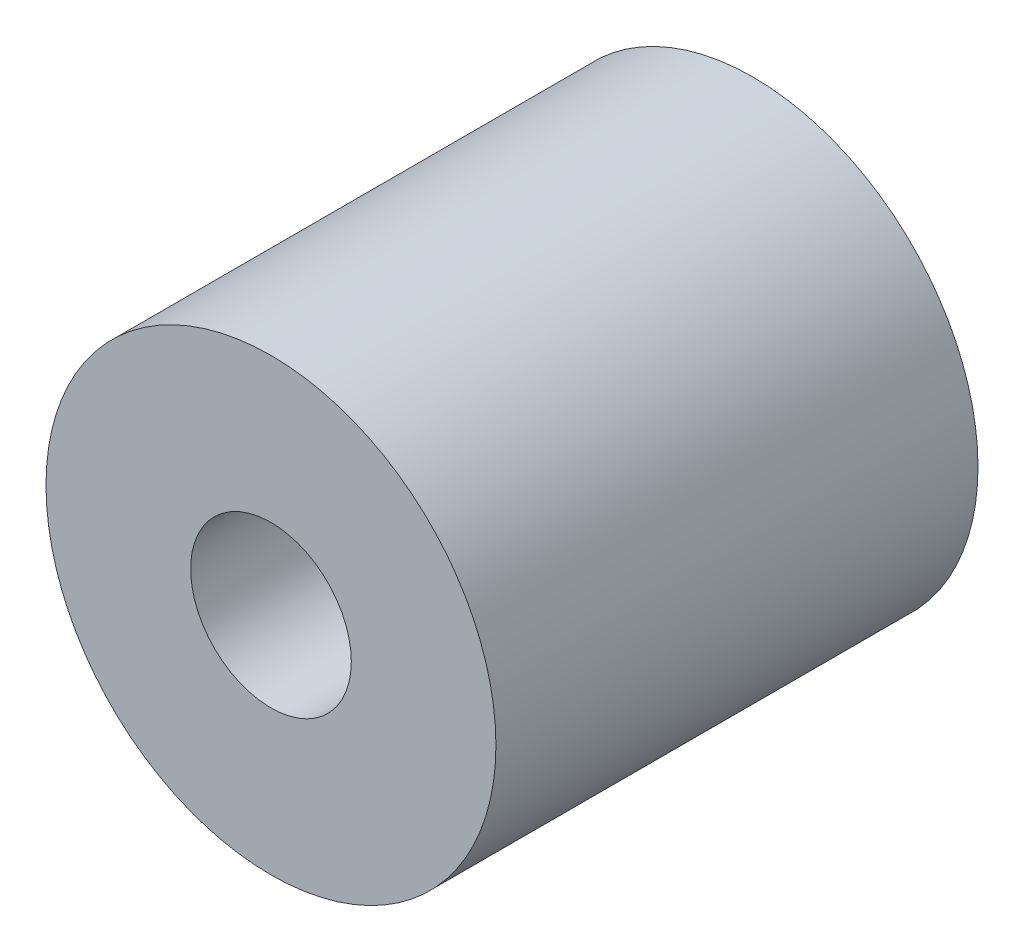
ISO-10303-21;
HEADER;
FILE_DESCRIPTION(('STEP AP214'),'2;1');
FILE_NAME('part.step','',(''),(''),'','','');
FILE_SCHEMA(('AUTOMOTIVE_DESIGN { 1 0 10303 214 1 1 1 1 }'));
ENDSEC;
DATA;
#1=APPLICATION_CONTEXT('core data for automotive mechanical design processes');
#2=APPLICATION_PROTOCOL_DEFINITION('international standard','automotive_design',2000,#1);
#3=PRODUCT_CONTEXT('',#1,'mechanical');
#4=PRODUCT('Part','Part','',(#3));
#5=PRODUCT_RELATED_PRODUCT_CATEGORY('part','',(#4));
#6=PRODUCT_DEFINITION_FORMATION('','',#4);
#7=PRODUCT_DEFINITION_CONTEXT('part definition',#1,'design');
#8=PRODUCT_DEFINITION('design','',#6,#7);
#9=PRODUCT_DEFINITION_SHAPE('','',#8);
#10=(LENGTH_UNIT() NAMED_UNIT(*) SI_UNIT(.MILLI.,.METRE.));
#11=(NAMED_UNIT(*) PLANE_ANGLE_UNIT() SI_UNIT($,.RADIAN.));
#12=(NAMED_UNIT(*) SI_UNIT($,.STERADIAN.) SOLID_ANGLE_UNIT());
#13=UNCERTAINTY_MEASURE_WITH_UNIT(LENGTH_MEASURE(1.E-05),#10,'distance_accuracy_value','');
#14=(GEOMETRIC_REPRESENTATION_CONTEXT(3) GLOBAL_UNCERTAINTY_ASSIGNED_CONTEXT((#13)) GLOBAL_UNIT_ASSIGNED_CONTEXT((#10,
#11,#12)) REPRESENTATION_CONTEXT('',''));
#15=CARTESIAN_POINT('',(0.,0.,0.));
#16=DIRECTION('',(0.,0.,1.));
#17=DIRECTION('',(1.,0.,0.));
#18=AXIS2_PLACEMENT_3D('',#15,#16,#17);
#19=CARTESIAN_POINT('',(0.,0.,15.));
#20=DIRECTION('',(0.,0.,-1.));
#21=DIRECTION('',(-1.,0.,0.));
#22=AXIS2_PLACEMENT_3D('',#19,#20,#21);
#23=CYLINDRICAL_SURFACE('',#22,7.);
#24=CARTESIAN_POINT('',(0.,0.,15.));
#25=DIRECTION('',(0.,0.,1.));
#26=DIRECTION('',(1.,0.,0.));
#27=AXIS2_PLACEMENT_3D('',#24,#25,#26);
#28=CIRCLE('',#27,7.);
#29=CARTESIAN_POINT('',(7.,0.,15.));
#30=VERTEX_POINT('',#29);
#31=EDGE_CURVE('E10',#30,#30,#28,.T.);
#32=ORIENTED_EDGE('',*,*,#31,.F.);
#33=EDGE_LOOP('',(#32));
#34=FACE_BOUND('',#33,.T.);
#35=CARTESIAN_POINT('',(0.,0.,0.));
#36=DIRECTION('',(0.,0.,1.));
#37=DIRECTION('',(1.,0.,0.));
#38=AXIS2_PLACEMENT_3D('',#35,#36,#37);
#39=CIRCLE('',#38,7.);
#40=CARTESIAN_POINT('',(7.,0.,0.));
#41=VERTEX_POINT('',#40);
#42=EDGE_CURVE('E40',#41,#41,#39,.T.);
#43=ORIENTED_EDGE('',*,*,#42,.T.);
#44=EDGE_LOOP('',(#43));
#45=FACE_BOUND('',#44,.T.);
#46=ADVANCED_FACE('F37',(#34,#45),#23,.T.);
#47=CARTESIAN_POINT('',(0.,0.,15.));
#48=DIRECTION('',(0.,0.,1.));
#49=DIRECTION('',(1.,0.,0.));
#50=AXIS2_PLACEMENT_3D('',#47,#48,#49);
#51=PLANE('',#50);
#52=CARTESIAN_POINT('',(0.,0.,15.));
#53=DIRECTION('',(0.,0.,1.));
#54=DIRECTION('',(1.,0.,0.));
#55=AXIS2_PLACEMENT_3D('',#52,#53,#54);
#56=CIRCLE('',#55,2.5);
#57=CARTESIAN_POINT('',(2.5,0.,15.));
#58=VERTEX_POINT('',#57);
#59=EDGE_CURVE('E49',#58,#58,#56,.T.);
#60=ORIENTED_EDGE('',*,*,#59,.F.);
#61=EDGE_LOOP('',(#60));
#62=FACE_BOUND('',#61,.T.);
#63=ORIENTED_EDGE('',*,*,#31,.T.);
#64=EDGE_LOOP('',(#63));
#65=FACE_BOUND('',#64,.T.);
#66=ADVANCED_FACE('F64',(#62,#65),#51,.T.);
#67=CARTESIAN_POINT('',(0.,0.,0.));
#68=DIRECTION('',(0.,0.,1.));
#69=DIRECTION('',(1.,0.,0.));
#70=AXIS2_PLACEMENT_3D('',#67,#68,#69);
#71=PLANE('',#70);
#72=CARTESIAN_POINT('',(0.,0.,0.));
#73=DIRECTION('',(0.,0.,1.));
#74=DIRECTION('',(1.,0.,0.));
#75=AXIS2_PLACEMENT_3D('',#72,#73,#74);
#76=CIRCLE('',#75,2.5);
#77=CARTESIAN_POINT('',(2.5,0.,0.));
#78=VERTEX_POINT('',#77);
#79=EDGE_CURVE('E47',#78,#78,#76,.T.);
#80=ORIENTED_EDGE('',*,*,#79,.T.);
#81=EDGE_LOOP('',(#80));
#82=FACE_BOUND('',#81,.T.);
#83=ORIENTED_EDGE('',*,*,#42,.F.);
#84=EDGE_LOOP('',(#83));
#85=FACE_BOUND('',#84,.T.);
#86=ADVANCED_FACE('F55',(#82,#85),#71,.F.);
#87=CARTESIAN_POINT('',(0.,0.,0.));
#88=DIRECTION('',(0.,0.,1.));
#89=DIRECTION('',(1.,0.,0.));
#90=AXIS2_PLACEMENT_3D('',#87,#88,#89);
#91=CYLINDRICAL_SURFACE('',#90,2.5);
#92=ORIENTED_EDGE('',*,*,#79,.F.);
#93=EDGE_LOOP('',(#92));
#94=FACE_BOUND('',#93,.T.);
#95=ORIENTED_EDGE('',*,*,#59,.T.);
#96=EDGE_LOOP('',(#95));
#97=FACE_BOUND('',#96,.T.);
#98=ADVANCED_FACE('F58',(#94,#97),#91,.F.);
#99=CLOSED_SHELL('',(#46,#66,#86,#98));
#100=MANIFOLD_SOLID_BREP('B2',#99);
#101=ADVANCED_BREP_SHAPE_REPRESENTATION('',(#18,#100),#14);
#102=SHAPE_DEFINITION_REPRESENTATION(#9,#101);
ENDSEC;
END-ISO-10303-21;
